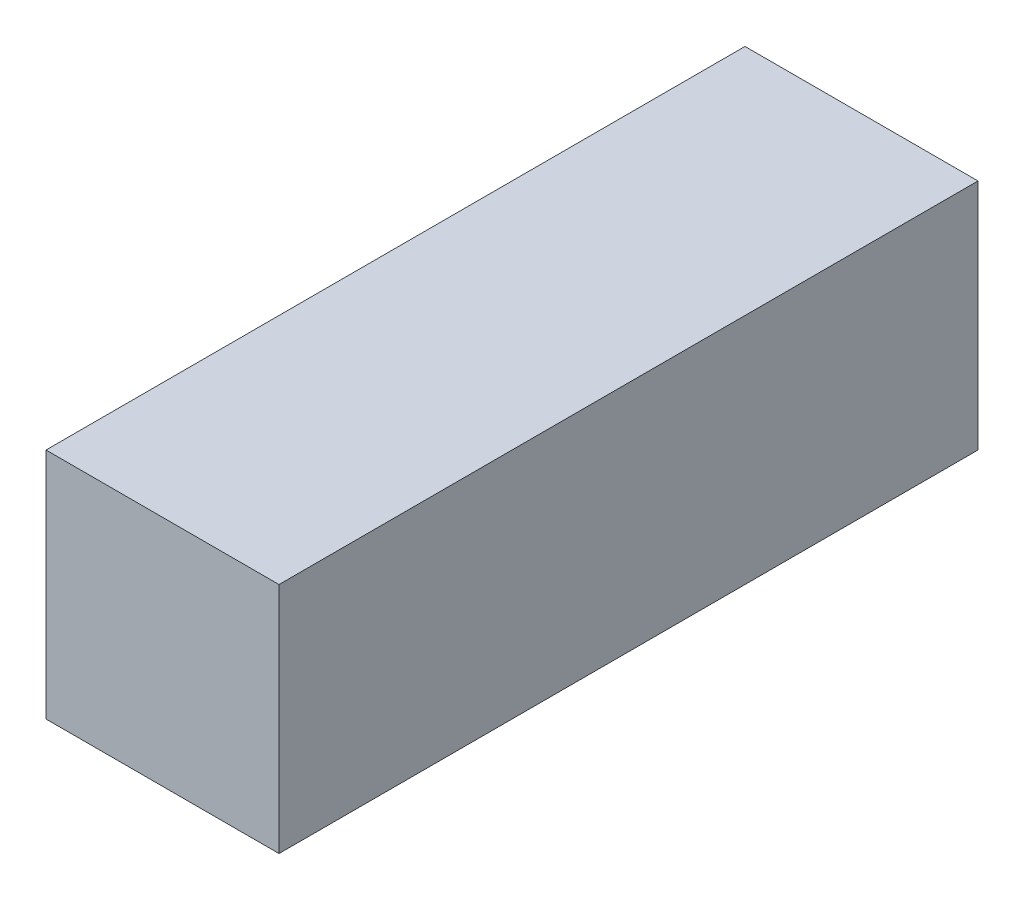
ISO-10303-21;
HEADER;
FILE_DESCRIPTION(('STEP AP214'),'2;1');
FILE_NAME('part.step','',(''),(''),'','','');
FILE_SCHEMA(('AUTOMOTIVE_DESIGN { 1 0 10303 214 1 1 1 1 }'));
ENDSEC;
DATA;
#1=APPLICATION_CONTEXT('core data for automotive mechanical design processes');
#2=APPLICATION_PROTOCOL_DEFINITION('international standard','automotive_design',2000,#1);
#3=PRODUCT_CONTEXT('',#1,'mechanical');
#4=PRODUCT('Part','Part','',(#3));
#5=PRODUCT_RELATED_PRODUCT_CATEGORY('part','',(#4));
#6=PRODUCT_DEFINITION_FORMATION('','',#4);
#7=PRODUCT_DEFINITION_CONTEXT('part definition',#1,'design');
#8=PRODUCT_DEFINITION('design','',#6,#7);
#9=PRODUCT_DEFINITION_SHAPE('','',#8);
#10=(LENGTH_UNIT() NAMED_UNIT(*) SI_UNIT(.MILLI.,.METRE.));
#11=(NAMED_UNIT(*) PLANE_ANGLE_UNIT() SI_UNIT($,.RADIAN.));
#12=(NAMED_UNIT(*) SI_UNIT($,.STERADIAN.) SOLID_ANGLE_UNIT());
#13=UNCERTAINTY_MEASURE_WITH_UNIT(LENGTH_MEASURE(1.E-05),#10,'distance_accuracy_value','');
#14=(GEOMETRIC_REPRESENTATION_CONTEXT(3) GLOBAL_UNCERTAINTY_ASSIGNED_CONTEXT((#13)) GLOBAL_UNIT_ASSIGNED_CONTEXT((#10,
#11,#12)) REPRESENTATION_CONTEXT('',''));
#15=CARTESIAN_POINT('',(0.,0.,0.));
#16=DIRECTION('',(0.,0.,1.));
#17=DIRECTION('',(1.,0.,0.));
#18=AXIS2_PLACEMENT_3D('',#15,#16,#17);
#19=CARTESIAN_POINT('',(-57.7617328519856,42.5992779783394,300.));
#20=DIRECTION('',(1.,0.,0.));
#21=DIRECTION('',(0.,1.,0.));
#22=AXIS2_PLACEMENT_3D('',#19,#20,#21);
#23=PLANE('',#22);
#24=DIRECTION('',(0.,-1.,0.));
#25=VECTOR('',#24,1.);
#26=CARTESIAN_POINT('',(-57.7617328519856,42.5992779783394,0.));
#27=LINE('',#26,#25);
#28=CARTESIAN_POINT('',(-57.7617328519856,42.5992779783394,0.));
#29=VERTEX_POINT('',#28);
#30=CARTESIAN_POINT('',(-57.7617328519855,-57.4007220216607,0.));
#31=VERTEX_POINT('',#30);
#32=EDGE_CURVE('E101',#29,#31,#27,.T.);
#33=ORIENTED_EDGE('',*,*,#32,.T.);
#34=DIRECTION('',(0.,0.,-1.));
#35=VECTOR('',#34,1.);
#36=CARTESIAN_POINT('',(-57.7617328519855,-57.4007220216607,300.));
#37=LINE('',#36,#35);
#38=CARTESIAN_POINT('',(-57.7617328519855,-57.4007220216607,300.));
#39=VERTEX_POINT('',#38);
#40=EDGE_CURVE('E11',#39,#31,#37,.T.);
#41=ORIENTED_EDGE('',*,*,#40,.F.);
#42=DIRECTION('',(0.,-1.,0.));
#43=VECTOR('',#42,1.);
#44=CARTESIAN_POINT('',(-57.7617328519856,42.5992779783394,300.));
#45=LINE('',#44,#43);
#46=CARTESIAN_POINT('',(-57.7617328519856,42.5992779783394,300.));
#47=VERTEX_POINT('',#46);
#48=EDGE_CURVE('E89',#47,#39,#45,.T.);
#49=ORIENTED_EDGE('',*,*,#48,.F.);
#50=DIRECTION('',(0.,0.,-1.));
#51=VECTOR('',#50,1.);
#52=CARTESIAN_POINT('',(-57.7617328519856,42.5992779783394,300.));
#53=LINE('',#52,#51);
#54=EDGE_CURVE('E97',#47,#29,#53,.T.);
#55=ORIENTED_EDGE('',*,*,#54,.T.);
#56=EDGE_LOOP('',(#33,#41,#49,#55));
#57=FACE_BOUND('',#56,.T.);
#58=ADVANCED_FACE('F38',(#57),#23,.F.);
#59=CARTESIAN_POINT('',(-57.7617328519855,-57.4007220216607,300.));
#60=DIRECTION('',(0.,1.,0.));
#61=DIRECTION('',(-1.,0.,0.));
#62=AXIS2_PLACEMENT_3D('',#59,#60,#61);
#63=PLANE('',#62);
#64=DIRECTION('',(1.,0.,0.));
#65=VECTOR('',#64,1.);
#66=CARTESIAN_POINT('',(-57.7617328519855,-57.4007220216607,0.));
#67=LINE('',#66,#65);
#68=CARTESIAN_POINT('',(42.2382671480144,-57.4007220216607,0.));
#69=VERTEX_POINT('',#68);
#70=EDGE_CURVE('E93',#31,#69,#67,.T.);
#71=ORIENTED_EDGE('',*,*,#70,.T.);
#72=DIRECTION('',(0.,0.,-1.));
#73=VECTOR('',#72,1.);
#74=CARTESIAN_POINT('',(42.2382671480144,-57.4007220216607,300.));
#75=LINE('',#74,#73);
#76=CARTESIAN_POINT('',(42.2382671480144,-57.4007220216607,300.));
#77=VERTEX_POINT('',#76);
#78=EDGE_CURVE('E46',#77,#69,#75,.T.);
#79=ORIENTED_EDGE('',*,*,#78,.F.);
#80=DIRECTION('',(1.,0.,0.));
#81=VECTOR('',#80,1.);
#82=CARTESIAN_POINT('',(-57.7617328519855,-57.4007220216607,300.));
#83=LINE('',#82,#81);
#84=EDGE_CURVE('E84',#39,#77,#83,.T.);
#85=ORIENTED_EDGE('',*,*,#84,.F.);
#86=ORIENTED_EDGE('',*,*,#40,.T.);
#87=EDGE_LOOP('',(#71,#79,#85,#86));
#88=FACE_BOUND('',#87,.T.);
#89=ADVANCED_FACE('F92',(#88),#63,.F.);
#90=CARTESIAN_POINT('',(42.2382671480144,42.5992779783394,300.));
#91=DIRECTION('',(-1.,0.,0.));
#92=DIRECTION('',(0.,0.,1.));
#93=AXIS2_PLACEMENT_3D('',#90,#91,#92);
#94=PLANE('',#93);
#95=DIRECTION('',(0.,1.,0.));
#96=VECTOR('',#95,1.);
#97=CARTESIAN_POINT('',(42.2382671480144,42.5992779783394,0.));
#98=LINE('',#97,#96);
#99=CARTESIAN_POINT('',(42.2382671480144,42.5992779783394,0.));
#100=VERTEX_POINT('',#99);
#101=EDGE_CURVE('E71',#69,#100,#98,.T.);
#102=ORIENTED_EDGE('',*,*,#101,.T.);
#103=DIRECTION('',(0.,0.,-1.));
#104=VECTOR('',#103,1.);
#105=CARTESIAN_POINT('',(42.2382671480144,42.5992779783394,300.));
#106=LINE('',#105,#104);
#107=CARTESIAN_POINT('',(42.2382671480144,42.5992779783394,300.));
#108=VERTEX_POINT('',#107);
#109=EDGE_CURVE('E94',#108,#100,#106,.T.);
#110=ORIENTED_EDGE('',*,*,#109,.F.);
#111=DIRECTION('',(0.,1.,0.));
#112=VECTOR('',#111,1.);
#113=CARTESIAN_POINT('',(42.2382671480144,42.5992779783394,300.));
#114=LINE('',#113,#112);
#115=EDGE_CURVE('E87',#77,#108,#114,.T.);
#116=ORIENTED_EDGE('',*,*,#115,.F.);
#117=ORIENTED_EDGE('',*,*,#78,.T.);
#118=EDGE_LOOP('',(#102,#110,#116,#117));
#119=FACE_BOUND('',#118,.T.);
#120=ADVANCED_FACE('F95',(#119),#94,.F.);
#121=CARTESIAN_POINT('',(-57.7617328519856,42.5992779783394,300.));
#122=DIRECTION('',(0.,-1.,0.));
#123=DIRECTION('',(0.,0.,-1.));
#124=AXIS2_PLACEMENT_3D('',#121,#122,#123);
#125=PLANE('',#124);
#126=DIRECTION('',(-1.,0.,0.));
#127=VECTOR('',#126,1.);
#128=CARTESIAN_POINT('',(-57.7617328519856,42.5992779783394,0.));
#129=LINE('',#128,#127);
#130=EDGE_CURVE('E77',#100,#29,#129,.T.);
#131=ORIENTED_EDGE('',*,*,#130,.T.);
#132=ORIENTED_EDGE('',*,*,#54,.F.);
#133=DIRECTION('',(-1.,0.,0.));
#134=VECTOR('',#133,1.);
#135=CARTESIAN_POINT('',(-57.7617328519856,42.5992779783394,300.));
#136=LINE('',#135,#134);
#137=EDGE_CURVE('E54',#108,#47,#136,.T.);
#138=ORIENTED_EDGE('',*,*,#137,.F.);
#139=ORIENTED_EDGE('',*,*,#109,.T.);
#140=EDGE_LOOP('',(#131,#132,#138,#139));
#141=FACE_BOUND('',#140,.T.);
#142=ADVANCED_FACE('F108',(#141),#125,.F.);
#143=CARTESIAN_POINT('',(0.,0.,300.));
#144=DIRECTION('',(0.,0.,1.));
#145=DIRECTION('',(1.,0.,0.));
#146=AXIS2_PLACEMENT_3D('',#143,#144,#145);
#147=PLANE('',#146);
#148=ORIENTED_EDGE('',*,*,#48,.T.);
#149=ORIENTED_EDGE('',*,*,#84,.T.);
#150=ORIENTED_EDGE('',*,*,#115,.T.);
#151=ORIENTED_EDGE('',*,*,#137,.T.);
#152=EDGE_LOOP('',(#148,#149,#150,#151));
#153=FACE_BOUND('',#152,.T.);
#154=ADVANCED_FACE('F85',(#153),#147,.T.);
#155=CARTESIAN_POINT('',(0.,0.,0.));
#156=DIRECTION('',(0.,0.,1.));
#157=DIRECTION('',(1.,0.,0.));
#158=AXIS2_PLACEMENT_3D('',#155,#156,#157);
#159=PLANE('',#158);
#160=ORIENTED_EDGE('',*,*,#32,.F.);
#161=ORIENTED_EDGE('',*,*,#130,.F.);
#162=ORIENTED_EDGE('',*,*,#101,.F.);
#163=ORIENTED_EDGE('',*,*,#70,.F.);
#164=EDGE_LOOP('',(#160,#161,#162,#163));
#165=FACE_BOUND('',#164,.T.);
#166=ADVANCED_FACE('F111',(#165),#159,.F.);
#167=CLOSED_SHELL('',(#58,#89,#120,#142,#154,#166));
#168=MANIFOLD_SOLID_BREP('B2',#167);
#169=ADVANCED_BREP_SHAPE_REPRESENTATION('',(#18,#168),#14);
#170=SHAPE_DEFINITION_REPRESENTATION(#9,#169);
ENDSEC;
END-ISO-10303-21;
